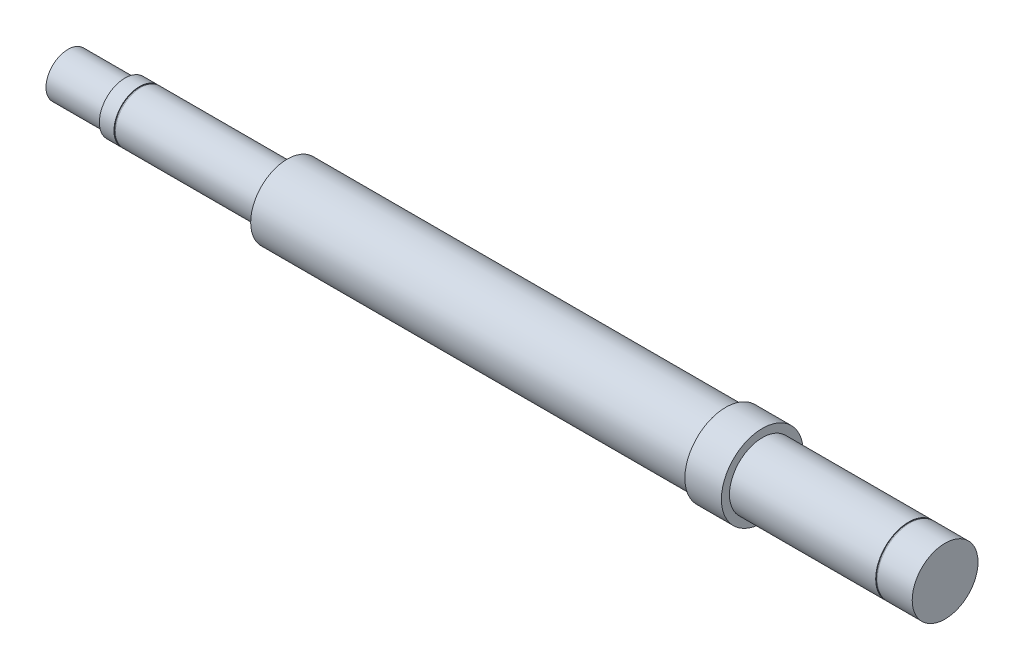
ISO-10303-21;
HEADER;
FILE_DESCRIPTION(('STEP AP214'),'2;1');
FILE_NAME('part.step','',(''),(''),'','','');
FILE_SCHEMA(('AUTOMOTIVE_DESIGN { 1 0 10303 214 1 1 1 1 }'));
ENDSEC;
DATA;
#1=APPLICATION_CONTEXT('core data for automotive mechanical design processes');
#2=APPLICATION_PROTOCOL_DEFINITION('international standard','automotive_design',2000,#1);
#3=PRODUCT_CONTEXT('',#1,'mechanical');
#4=PRODUCT('Part','Part','',(#3));
#5=PRODUCT_RELATED_PRODUCT_CATEGORY('part','',(#4));
#6=PRODUCT_DEFINITION_FORMATION('','',#4);
#7=PRODUCT_DEFINITION_CONTEXT('part definition',#1,'design');
#8=PRODUCT_DEFINITION('design','',#6,#7);
#9=PRODUCT_DEFINITION_SHAPE('','',#8);
#10=(LENGTH_UNIT() NAMED_UNIT(*) SI_UNIT(.MILLI.,.METRE.));
#11=(NAMED_UNIT(*) PLANE_ANGLE_UNIT() SI_UNIT($,.RADIAN.));
#12=(NAMED_UNIT(*) SI_UNIT($,.STERADIAN.) SOLID_ANGLE_UNIT());
#13=UNCERTAINTY_MEASURE_WITH_UNIT(LENGTH_MEASURE(1.E-05),#10,'distance_accuracy_value','');
#14=(GEOMETRIC_REPRESENTATION_CONTEXT(3) GLOBAL_UNCERTAINTY_ASSIGNED_CONTEXT((#13)) GLOBAL_UNIT_ASSIGNED_CONTEXT((#10,
#11,#12)) REPRESENTATION_CONTEXT('',''));
#15=CARTESIAN_POINT('',(0.,0.,0.));
#16=DIRECTION('',(0.,0.,1.));
#17=DIRECTION('',(1.,0.,0.));
#18=AXIS2_PLACEMENT_3D('',#15,#16,#17);
#19=CARTESIAN_POINT('',(576.,0.,0.));
#20=DIRECTION('',(-1.,0.,0.));
#21=DIRECTION('',(0.,0.,1.));
#22=AXIS2_PLACEMENT_3D('',#19,#20,#21);
#23=PLANE('',#22);
#24=CARTESIAN_POINT('',(576.,0.,0.));
#25=DIRECTION('',(-1.,0.,0.));
#26=DIRECTION('',(0.,0.,1.));
#27=AXIS2_PLACEMENT_3D('',#24,#25,#26);
#28=CIRCLE('',#27,22.);
#29=CARTESIAN_POINT('',(576.,0.,22.));
#30=VERTEX_POINT('',#29);
#31=EDGE_CURVE('E104',#30,#30,#28,.T.);
#32=ORIENTED_EDGE('',*,*,#31,.F.);
#33=EDGE_LOOP('',(#32));
#34=FACE_BOUND('',#33,.T.);
#35=CARTESIAN_POINT('',(576.,0.,0.));
#36=DIRECTION('',(-1.,0.,0.));
#37=DIRECTION('',(0.,0.,1.));
#38=AXIS2_PLACEMENT_3D('',#35,#36,#37);
#39=CIRCLE('',#38,22.5);
#40=CARTESIAN_POINT('',(576.,0.,22.5));
#41=VERTEX_POINT('',#40);
#42=EDGE_CURVE('E113',#41,#41,#39,.T.);
#43=ORIENTED_EDGE('',*,*,#42,.T.);
#44=EDGE_LOOP('',(#43));
#45=FACE_BOUND('',#44,.T.);
#46=ADVANCED_FACE('F56',(#34,#45),#23,.T.);
#47=CARTESIAN_POINT('',(450.,0.,0.));
#48=DIRECTION('',(-1.,0.,0.));
#49=DIRECTION('',(0.,0.,1.));
#50=AXIS2_PLACEMENT_3D('',#47,#48,#49);
#51=PLANE('',#50);
#52=CARTESIAN_POINT('',(450.,0.,0.));
#53=DIRECTION('',(-1.,0.,0.));
#54=DIRECTION('',(0.,0.,1.));
#55=AXIS2_PLACEMENT_3D('',#52,#53,#54);
#56=CIRCLE('',#55,25.);
#57=CARTESIAN_POINT('',(450.,0.,25.));
#58=VERTEX_POINT('',#57);
#59=EDGE_CURVE('E84',#58,#58,#56,.T.);
#60=ORIENTED_EDGE('',*,*,#59,.F.);
#61=EDGE_LOOP('',(#60));
#62=FACE_BOUND('',#61,.T.);
#63=CARTESIAN_POINT('',(450.,0.,0.));
#64=DIRECTION('',(-1.,0.,0.));
#65=DIRECTION('',(0.,0.,1.));
#66=AXIS2_PLACEMENT_3D('',#63,#64,#65);
#67=CIRCLE('',#66,28.);
#68=CARTESIAN_POINT('',(450.,0.,28.));
#69=VERTEX_POINT('',#68);
#70=EDGE_CURVE('E90',#69,#69,#67,.T.);
#71=ORIENTED_EDGE('',*,*,#70,.T.);
#72=EDGE_LOOP('',(#71));
#73=FACE_BOUND('',#72,.T.);
#74=ADVANCED_FACE('F131',(#62,#73),#51,.T.);
#75=CARTESIAN_POINT('',(150.,0.,0.));
#76=DIRECTION('',(-1.,0.,0.));
#77=DIRECTION('',(0.,0.,1.));
#78=AXIS2_PLACEMENT_3D('',#75,#76,#77);
#79=PLANE('',#78);
#80=CARTESIAN_POINT('',(150.,0.,0.));
#81=DIRECTION('',(-1.,0.,0.));
#82=DIRECTION('',(0.,0.,1.));
#83=AXIS2_PLACEMENT_3D('',#80,#81,#82);
#84=CIRCLE('',#83,17.5);
#85=CARTESIAN_POINT('',(150.,0.,17.5));
#86=VERTEX_POINT('',#85);
#87=EDGE_CURVE('E78',#86,#86,#84,.T.);
#88=ORIENTED_EDGE('',*,*,#87,.F.);
#89=EDGE_LOOP('',(#88));
#90=FACE_BOUND('',#89,.T.);
#91=CARTESIAN_POINT('',(150.,0.,0.));
#92=DIRECTION('',(-1.,0.,0.));
#93=DIRECTION('',(0.,0.,1.));
#94=AXIS2_PLACEMENT_3D('',#91,#92,#93);
#95=CIRCLE('',#94,25.);
#96=CARTESIAN_POINT('',(150.,0.,25.));
#97=VERTEX_POINT('',#96);
#98=EDGE_CURVE('E87',#97,#97,#95,.T.);
#99=ORIENTED_EDGE('',*,*,#98,.T.);
#100=EDGE_LOOP('',(#99));
#101=FACE_BOUND('',#100,.T.);
#102=ADVANCED_FACE('F137',(#90,#101),#79,.T.);
#103=CARTESIAN_POINT('',(50.,0.,0.));
#104=DIRECTION('',(-1.,0.,0.));
#105=DIRECTION('',(0.,0.,1.));
#106=AXIS2_PLACEMENT_3D('',#103,#104,#105);
#107=PLANE('',#106);
#108=CARTESIAN_POINT('',(50.,0.,0.));
#109=DIRECTION('',(-1.,0.,0.));
#110=DIRECTION('',(0.,0.,1.));
#111=AXIS2_PLACEMENT_3D('',#108,#109,#110);
#112=CIRCLE('',#111,17.);
#113=CARTESIAN_POINT('',(50.,0.,17.));
#114=VERTEX_POINT('',#113);
#115=EDGE_CURVE('E74',#114,#114,#112,.T.);
#116=ORIENTED_EDGE('',*,*,#115,.F.);
#117=EDGE_LOOP('',(#116));
#118=FACE_BOUND('',#117,.T.);
#119=CARTESIAN_POINT('',(50.,0.,0.));
#120=DIRECTION('',(-1.,0.,0.));
#121=DIRECTION('',(0.,0.,1.));
#122=AXIS2_PLACEMENT_3D('',#119,#120,#121);
#123=CIRCLE('',#122,17.5);
#124=CARTESIAN_POINT('',(50.,0.,17.5));
#125=VERTEX_POINT('',#124);
#126=EDGE_CURVE('E81',#125,#125,#123,.T.);
#127=ORIENTED_EDGE('',*,*,#126,.T.);
#128=EDGE_LOOP('',(#127));
#129=FACE_BOUND('',#128,.T.);
#130=ADVANCED_FACE('F170',(#118,#129),#107,.T.);
#131=CARTESIAN_POINT('',(39.,0.,0.));
#132=DIRECTION('',(-1.,0.,0.));
#133=DIRECTION('',(0.,0.,1.));
#134=AXIS2_PLACEMENT_3D('',#131,#132,#133);
#135=PLANE('',#134);
#136=CARTESIAN_POINT('',(39.,0.,0.));
#137=DIRECTION('',(-1.,0.,0.));
#138=DIRECTION('',(0.,0.,1.));
#139=AXIS2_PLACEMENT_3D('',#136,#137,#138);
#140=CIRCLE('',#139,15.);
#141=CARTESIAN_POINT('',(39.,0.,15.));
#142=VERTEX_POINT('',#141);
#143=EDGE_CURVE('E13',#142,#142,#140,.T.);
#144=ORIENTED_EDGE('',*,*,#143,.F.);
#145=EDGE_LOOP('',(#144));
#146=FACE_BOUND('',#145,.T.);
#147=CARTESIAN_POINT('',(39.,0.,0.));
#148=DIRECTION('',(-1.,0.,0.));
#149=DIRECTION('',(0.,0.,1.));
#150=AXIS2_PLACEMENT_3D('',#147,#148,#149);
#151=CIRCLE('',#150,17.5);
#152=CARTESIAN_POINT('',(39.,0.,17.5));
#153=VERTEX_POINT('',#152);
#154=EDGE_CURVE('E67',#153,#153,#151,.T.);
#155=ORIENTED_EDGE('',*,*,#154,.T.);
#156=EDGE_LOOP('',(#155));
#157=FACE_BOUND('',#156,.T.);
#158=ADVANCED_FACE('F178',(#146,#157),#135,.T.);
#159=CARTESIAN_POINT('',(39.,0.,0.));
#160=DIRECTION('',(-1.,0.,0.));
#161=DIRECTION('',(0.,0.,1.));
#162=AXIS2_PLACEMENT_3D('',#159,#160,#161);
#163=CYLINDRICAL_SURFACE('',#162,15.);
#164=ORIENTED_EDGE('',*,*,#143,.T.);
#165=EDGE_LOOP('',(#164));
#166=FACE_BOUND('',#165,.T.);
#167=CARTESIAN_POINT('',(0.,0.,0.));
#168=DIRECTION('',(-1.,0.,0.));
#169=DIRECTION('',(0.,0.,1.));
#170=AXIS2_PLACEMENT_3D('',#167,#168,#169);
#171=CIRCLE('',#170,15.);
#172=CARTESIAN_POINT('',(0.,0.,15.));
#173=VERTEX_POINT('',#172);
#174=EDGE_CURVE('E60',#173,#173,#171,.T.);
#175=ORIENTED_EDGE('',*,*,#174,.F.);
#176=EDGE_LOOP('',(#175));
#177=FACE_BOUND('',#176,.T.);
#178=ADVANCED_FACE('F187',(#166,#177),#163,.T.);
#179=CARTESIAN_POINT('',(0.,0.,0.));
#180=DIRECTION('',(1.,0.,0.));
#181=DIRECTION('',(0.,0.,-1.));
#182=AXIS2_PLACEMENT_3D('',#179,#180,#181);
#183=PLANE('',#182);
#184=ORIENTED_EDGE('',*,*,#174,.T.);
#185=EDGE_LOOP('',(#184));
#186=FACE_BOUND('',#185,.T.);
#187=ADVANCED_FACE('F58',(#186),#183,.F.);
#188=CARTESIAN_POINT('',(49.,0.,0.));
#189=DIRECTION('',(-1.,0.,0.));
#190=DIRECTION('',(0.,0.,1.));
#191=AXIS2_PLACEMENT_3D('',#188,#189,#190);
#192=CYLINDRICAL_SURFACE('',#191,17.5);
#193=CARTESIAN_POINT('',(49.,0.,0.));
#194=DIRECTION('',(-1.,0.,0.));
#195=DIRECTION('',(0.,0.,1.));
#196=AXIS2_PLACEMENT_3D('',#193,#194,#195);
#197=CIRCLE('',#196,17.5);
#198=CARTESIAN_POINT('',(49.,0.,17.5));
#199=VERTEX_POINT('',#198);
#200=EDGE_CURVE('E71',#199,#199,#197,.F.);
#201=ORIENTED_EDGE('',*,*,#200,.F.);
#202=EDGE_LOOP('',(#201));
#203=FACE_BOUND('',#202,.T.);
#204=ORIENTED_EDGE('',*,*,#154,.F.);
#205=EDGE_LOOP('',(#204));
#206=FACE_BOUND('',#205,.T.);
#207=ADVANCED_FACE('F182',(#203,#206),#192,.T.);
#208=CARTESIAN_POINT('',(49.,0.,0.));
#209=DIRECTION('',(-1.,0.,0.));
#210=DIRECTION('',(0.,0.,1.));
#211=AXIS2_PLACEMENT_3D('',#208,#209,#210);
#212=PLANE('',#211);
#213=ORIENTED_EDGE('',*,*,#200,.T.);
#214=EDGE_LOOP('',(#213));
#215=FACE_BOUND('',#214,.T.);
#216=CARTESIAN_POINT('',(49.,0.,0.));
#217=DIRECTION('',(-1.,0.,0.));
#218=DIRECTION('',(0.,0.,1.));
#219=AXIS2_PLACEMENT_3D('',#216,#217,#218);
#220=CIRCLE('',#219,17.);
#221=CARTESIAN_POINT('',(49.,0.,17.));
#222=VERTEX_POINT('',#221);
#223=EDGE_CURVE('E75',#222,#222,#220,.T.);
#224=ORIENTED_EDGE('',*,*,#223,.T.);
#225=EDGE_LOOP('',(#224));
#226=FACE_BOUND('',#225,.T.);
#227=ADVANCED_FACE('F174',(#215,#226),#212,.F.);
#228=CARTESIAN_POINT('',(50.,0.,0.));
#229=DIRECTION('',(-1.,0.,0.));
#230=DIRECTION('',(0.,0.,1.));
#231=AXIS2_PLACEMENT_3D('',#228,#229,#230);
#232=CYLINDRICAL_SURFACE('',#231,17.);
#233=ORIENTED_EDGE('',*,*,#115,.T.);
#234=EDGE_LOOP('',(#233));
#235=FACE_BOUND('',#234,.T.);
#236=ORIENTED_EDGE('',*,*,#223,.F.);
#237=EDGE_LOOP('',(#236));
#238=FACE_BOUND('',#237,.T.);
#239=ADVANCED_FACE('F166',(#235,#238),#232,.T.);
#240=CARTESIAN_POINT('',(150.,0.,0.));
#241=DIRECTION('',(-1.,0.,0.));
#242=DIRECTION('',(0.,0.,1.));
#243=AXIS2_PLACEMENT_3D('',#240,#241,#242);
#244=CYLINDRICAL_SURFACE('',#243,17.5);
#245=ORIENTED_EDGE('',*,*,#87,.T.);
#246=EDGE_LOOP('',(#245));
#247=FACE_BOUND('',#246,.T.);
#248=ORIENTED_EDGE('',*,*,#126,.F.);
#249=EDGE_LOOP('',(#248));
#250=FACE_BOUND('',#249,.T.);
#251=ADVANCED_FACE('F161',(#247,#250),#244,.T.);
#252=CARTESIAN_POINT('',(450.,0.,0.));
#253=DIRECTION('',(-1.,0.,0.));
#254=DIRECTION('',(0.,0.,1.));
#255=AXIS2_PLACEMENT_3D('',#252,#253,#254);
#256=CYLINDRICAL_SURFACE('',#255,25.);
#257=ORIENTED_EDGE('',*,*,#59,.T.);
#258=EDGE_LOOP('',(#257));
#259=FACE_BOUND('',#258,.T.);
#260=ORIENTED_EDGE('',*,*,#98,.F.);
#261=EDGE_LOOP('',(#260));
#262=FACE_BOUND('',#261,.T.);
#263=ADVANCED_FACE('F158',(#259,#262),#256,.T.);
#264=CARTESIAN_POINT('',(475.,0.,0.));
#265=DIRECTION('',(-1.,0.,0.));
#266=DIRECTION('',(0.,0.,1.));
#267=AXIS2_PLACEMENT_3D('',#264,#265,#266);
#268=CYLINDRICAL_SURFACE('',#267,28.);
#269=CARTESIAN_POINT('',(475.,0.,0.));
#270=DIRECTION('',(-1.,0.,0.));
#271=DIRECTION('',(0.,0.,1.));
#272=AXIS2_PLACEMENT_3D('',#269,#270,#271);
#273=CIRCLE('',#272,28.);
#274=CARTESIAN_POINT('',(475.,0.,28.));
#275=VERTEX_POINT('',#274);
#276=EDGE_CURVE('E95',#275,#275,#273,.F.);
#277=ORIENTED_EDGE('',*,*,#276,.F.);
#278=EDGE_LOOP('',(#277));
#279=FACE_BOUND('',#278,.T.);
#280=ORIENTED_EDGE('',*,*,#70,.F.);
#281=EDGE_LOOP('',(#280));
#282=FACE_BOUND('',#281,.T.);
#283=ADVANCED_FACE('F154',(#279,#282),#268,.T.);
#284=CARTESIAN_POINT('',(475.,0.,0.));
#285=DIRECTION('',(-1.,0.,0.));
#286=DIRECTION('',(0.,0.,1.));
#287=AXIS2_PLACEMENT_3D('',#284,#285,#286);
#288=PLANE('',#287);
#289=ORIENTED_EDGE('',*,*,#276,.T.);
#290=EDGE_LOOP('',(#289));
#291=FACE_BOUND('',#290,.T.);
#292=CARTESIAN_POINT('',(475.,0.,0.));
#293=DIRECTION('',(-1.,0.,0.));
#294=DIRECTION('',(0.,0.,1.));
#295=AXIS2_PLACEMENT_3D('',#292,#293,#294);
#296=CIRCLE('',#295,22.5);
#297=CARTESIAN_POINT('',(475.,0.,22.5));
#298=VERTEX_POINT('',#297);
#299=EDGE_CURVE('E98',#298,#298,#296,.T.);
#300=ORIENTED_EDGE('',*,*,#299,.T.);
#301=EDGE_LOOP('',(#300));
#302=FACE_BOUND('',#301,.T.);
#303=ADVANCED_FACE('F150',(#291,#302),#288,.F.);
#304=CARTESIAN_POINT('',(575.,0.,0.));
#305=DIRECTION('',(-1.,0.,0.));
#306=DIRECTION('',(0.,0.,1.));
#307=AXIS2_PLACEMENT_3D('',#304,#305,#306);
#308=CYLINDRICAL_SURFACE('',#307,22.5);
#309=CARTESIAN_POINT('',(575.,0.,0.));
#310=DIRECTION('',(-1.,0.,0.));
#311=DIRECTION('',(0.,0.,1.));
#312=AXIS2_PLACEMENT_3D('',#309,#310,#311);
#313=CIRCLE('',#312,22.5);
#314=CARTESIAN_POINT('',(575.,0.,22.5));
#315=VERTEX_POINT('',#314);
#316=EDGE_CURVE('E101',#315,#315,#313,.F.);
#317=ORIENTED_EDGE('',*,*,#316,.F.);
#318=EDGE_LOOP('',(#317));
#319=FACE_BOUND('',#318,.T.);
#320=ORIENTED_EDGE('',*,*,#299,.F.);
#321=EDGE_LOOP('',(#320));
#322=FACE_BOUND('',#321,.T.);
#323=ADVANCED_FACE('F146',(#319,#322),#308,.T.);
#324=CARTESIAN_POINT('',(575.,0.,0.));
#325=DIRECTION('',(-1.,0.,0.));
#326=DIRECTION('',(0.,0.,1.));
#327=AXIS2_PLACEMENT_3D('',#324,#325,#326);
#328=PLANE('',#327);
#329=ORIENTED_EDGE('',*,*,#316,.T.);
#330=EDGE_LOOP('',(#329));
#331=FACE_BOUND('',#330,.T.);
#332=CARTESIAN_POINT('',(575.,0.,0.));
#333=DIRECTION('',(-1.,0.,0.));
#334=DIRECTION('',(0.,0.,1.));
#335=AXIS2_PLACEMENT_3D('',#332,#333,#334);
#336=CIRCLE('',#335,22.);
#337=CARTESIAN_POINT('',(575.,0.,22.));
#338=VERTEX_POINT('',#337);
#339=EDGE_CURVE('E105',#338,#338,#336,.T.);
#340=ORIENTED_EDGE('',*,*,#339,.T.);
#341=EDGE_LOOP('',(#340));
#342=FACE_BOUND('',#341,.T.);
#343=ADVANCED_FACE('F143',(#331,#342),#328,.F.);
#344=CARTESIAN_POINT('',(576.,0.,0.));
#345=DIRECTION('',(-1.,0.,0.));
#346=DIRECTION('',(0.,0.,1.));
#347=AXIS2_PLACEMENT_3D('',#344,#345,#346);
#348=CYLINDRICAL_SURFACE('',#347,22.);
#349=ORIENTED_EDGE('',*,*,#31,.T.);
#350=EDGE_LOOP('',(#349));
#351=FACE_BOUND('',#350,.T.);
#352=ORIENTED_EDGE('',*,*,#339,.F.);
#353=EDGE_LOOP('',(#352));
#354=FACE_BOUND('',#353,.T.);
#355=ADVANCED_FACE('F122',(#351,#354),#348,.T.);
#356=CARTESIAN_POINT('',(2028.35569799683,0.,0.));
#357=DIRECTION('',(-1.,0.,0.));
#358=DIRECTION('',(0.,0.,1.));
#359=AXIS2_PLACEMENT_3D('',#356,#357,#358);
#360=CYLINDRICAL_SURFACE('',#359,22.5);
#361=ORIENTED_EDGE('',*,*,#42,.F.);
#362=EDGE_LOOP('',(#361));
#363=FACE_BOUND('',#362,.T.);
#364=CARTESIAN_POINT('',(600.,0.,0.));
#365=DIRECTION('',(1.,0.,0.));
#366=DIRECTION('',(0.,0.,-1.));
#367=AXIS2_PLACEMENT_3D('',#364,#365,#366);
#368=CIRCLE('',#367,22.5);
#369=CARTESIAN_POINT('',(600.,0.,-22.5));
#370=VERTEX_POINT('',#369);
#371=EDGE_CURVE('E108',#370,#370,#368,.F.);
#372=ORIENTED_EDGE('',*,*,#371,.T.);
#373=EDGE_LOOP('',(#372));
#374=FACE_BOUND('',#373,.T.);
#375=ADVANCED_FACE('F118',(#363,#374),#360,.T.);
#376=CARTESIAN_POINT('',(600.,0.,0.));
#377=DIRECTION('',(1.,0.,0.));
#378=DIRECTION('',(0.,0.,-1.));
#379=AXIS2_PLACEMENT_3D('',#376,#377,#378);
#380=PLANE('',#379);
#381=ORIENTED_EDGE('',*,*,#371,.F.);
#382=EDGE_LOOP('',(#381));
#383=FACE_BOUND('',#382,.T.);
#384=ADVANCED_FACE('F121',(#383),#380,.T.);
#385=CLOSED_SHELL('',(#46,#74,#102,#130,#158,#178,#187,#207,#227,#239,#251,#263,#283,#303,#323,
#343,#355,#375,#384));
#386=MANIFOLD_SOLID_BREP('B2',#385);
#387=ADVANCED_BREP_SHAPE_REPRESENTATION('',(#18,#386),#14);
#388=SHAPE_DEFINITION_REPRESENTATION(#9,#387);
ENDSEC;
END-ISO-10303-21;
